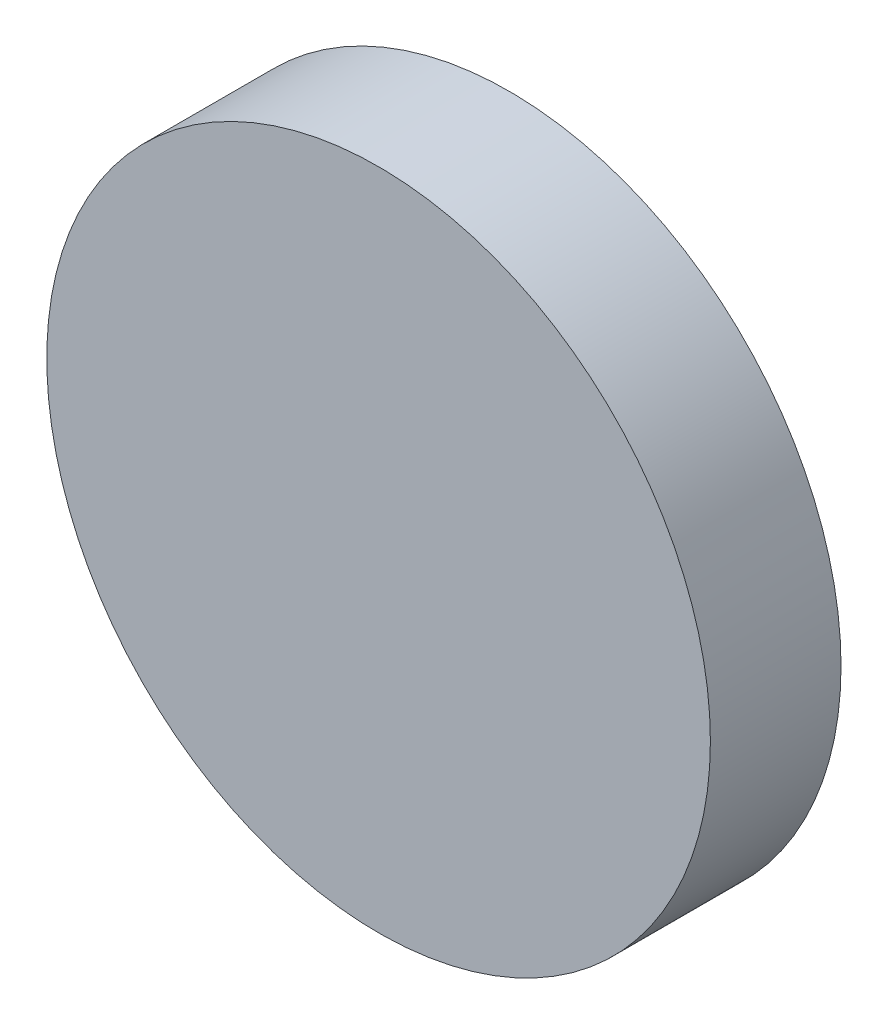
ISO-10303-21;
HEADER;
FILE_DESCRIPTION(('STEP AP214'),'2;1');
FILE_NAME('part.step','',(''),(''),'','','');
FILE_SCHEMA(('AUTOMOTIVE_DESIGN { 1 0 10303 214 1 1 1 1 }'));
ENDSEC;
DATA;
#1=APPLICATION_CONTEXT('core data for automotive mechanical design processes');
#2=APPLICATION_PROTOCOL_DEFINITION('international standard','automotive_design',2000,#1);
#3=PRODUCT_CONTEXT('',#1,'mechanical');
#4=PRODUCT('Part','Part','',(#3));
#5=PRODUCT_RELATED_PRODUCT_CATEGORY('part','',(#4));
#6=PRODUCT_DEFINITION_FORMATION('','',#4);
#7=PRODUCT_DEFINITION_CONTEXT('part definition',#1,'design');
#8=PRODUCT_DEFINITION('design','',#6,#7);
#9=PRODUCT_DEFINITION_SHAPE('','',#8);
#10=(LENGTH_UNIT() NAMED_UNIT(*) SI_UNIT(.MILLI.,.METRE.));
#11=(NAMED_UNIT(*) PLANE_ANGLE_UNIT() SI_UNIT($,.RADIAN.));
#12=(NAMED_UNIT(*) SI_UNIT($,.STERADIAN.) SOLID_ANGLE_UNIT());
#13=UNCERTAINTY_MEASURE_WITH_UNIT(LENGTH_MEASURE(1.E-05),#10,'distance_accuracy_value','');
#14=(GEOMETRIC_REPRESENTATION_CONTEXT(3) GLOBAL_UNCERTAINTY_ASSIGNED_CONTEXT((#13)) GLOBAL_UNIT_ASSIGNED_CONTEXT((#10,
#11,#12)) REPRESENTATION_CONTEXT('',''));
#15=CARTESIAN_POINT('',(0.,0.,0.));
#16=DIRECTION('',(0.,0.,1.));
#17=DIRECTION('',(1.,0.,0.));
#18=AXIS2_PLACEMENT_3D('',#15,#16,#17);
#19=CARTESIAN_POINT('',(-19.8786858861816,7.25633012409696,30.));
#20=DIRECTION('',(0.,0.,-1.));
#21=DIRECTION('',(-1.,0.,0.));
#22=AXIS2_PLACEMENT_3D('',#19,#20,#21);
#23=CYLINDRICAL_SURFACE('',#22,76.2);
#24=CARTESIAN_POINT('',(-19.8786858861816,7.25633012409696,30.));
#25=DIRECTION('',(0.,0.,1.));
#26=DIRECTION('',(1.,0.,0.));
#27=AXIS2_PLACEMENT_3D('',#24,#25,#26);
#28=CIRCLE('',#27,76.2);
#29=CARTESIAN_POINT('',(56.3213141138184,7.25633012409696,30.));
#30=VERTEX_POINT('',#29);
#31=EDGE_CURVE('E10',#30,#30,#28,.T.);
#32=ORIENTED_EDGE('',*,*,#31,.F.);
#33=EDGE_LOOP('',(#32));
#34=FACE_BOUND('',#33,.T.);
#35=CARTESIAN_POINT('',(-19.8786858861816,7.25633012409696,0.));
#36=DIRECTION('',(0.,0.,1.));
#37=DIRECTION('',(1.,0.,0.));
#38=AXIS2_PLACEMENT_3D('',#35,#36,#37);
#39=CIRCLE('',#38,76.2);
#40=CARTESIAN_POINT('',(56.3213141138184,7.25633012409696,0.));
#41=VERTEX_POINT('',#40);
#42=EDGE_CURVE('E34',#41,#41,#39,.T.);
#43=ORIENTED_EDGE('',*,*,#42,.T.);
#44=EDGE_LOOP('',(#43));
#45=FACE_BOUND('',#44,.T.);
#46=ADVANCED_FACE('F31',(#34,#45),#23,.T.);
#47=CARTESIAN_POINT('',(-19.8786858861816,7.25633012409696,30.));
#48=DIRECTION('',(0.,0.,1.));
#49=DIRECTION('',(1.,0.,0.));
#50=AXIS2_PLACEMENT_3D('',#47,#48,#49);
#51=PLANE('',#50);
#52=ORIENTED_EDGE('',*,*,#31,.T.);
#53=EDGE_LOOP('',(#52));
#54=FACE_BOUND('',#53,.T.);
#55=ADVANCED_FACE('F46',(#54),#51,.T.);
#56=CARTESIAN_POINT('',(-19.8786858861816,7.25633012409696,0.));
#57=DIRECTION('',(0.,0.,1.));
#58=DIRECTION('',(1.,0.,0.));
#59=AXIS2_PLACEMENT_3D('',#56,#57,#58);
#60=PLANE('',#59);
#61=ORIENTED_EDGE('',*,*,#42,.F.);
#62=EDGE_LOOP('',(#61));
#63=FACE_BOUND('',#62,.T.);
#64=ADVANCED_FACE('F44',(#63),#60,.F.);
#65=CLOSED_SHELL('',(#46,#55,#64));
#66=MANIFOLD_SOLID_BREP('B2',#65);
#67=ADVANCED_BREP_SHAPE_REPRESENTATION('',(#18,#66),#14);
#68=SHAPE_DEFINITION_REPRESENTATION(#9,#67);
ENDSEC;
END-ISO-10303-21;
